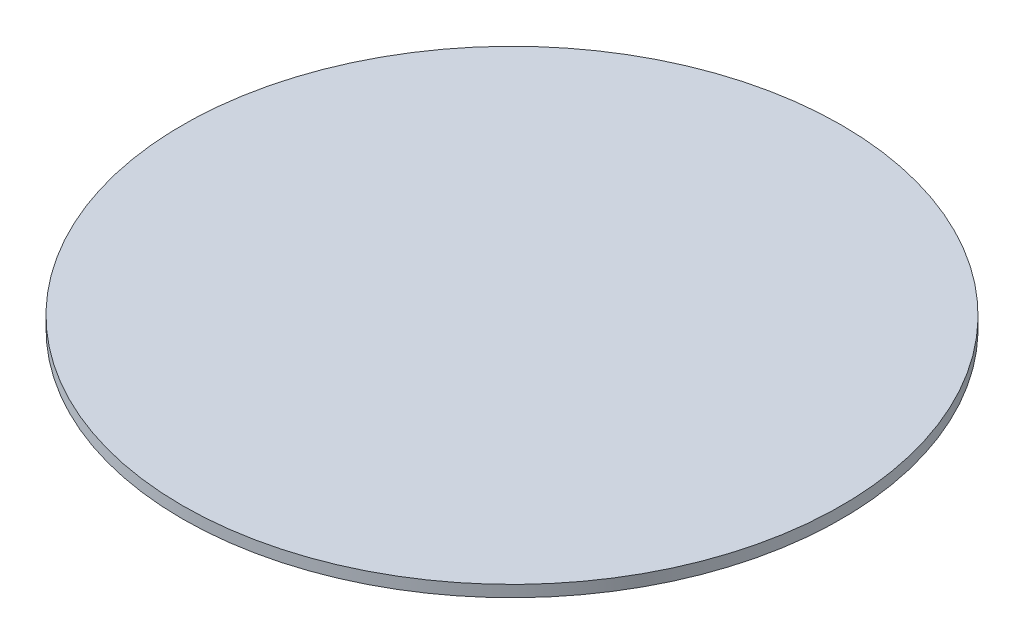
ISO-10303-21;
HEADER;
FILE_DESCRIPTION(('STEP AP214'),'2;1');
FILE_NAME('part.step','',(''),(''),'','','');
FILE_SCHEMA(('AUTOMOTIVE_DESIGN { 1 0 10303 214 1 1 1 1 }'));
ENDSEC;
DATA;
#1=APPLICATION_CONTEXT('core data for automotive mechanical design processes');
#2=APPLICATION_PROTOCOL_DEFINITION('international standard','automotive_design',2000,#1);
#3=PRODUCT_CONTEXT('',#1,'mechanical');
#4=PRODUCT('Part','Part','',(#3));
#5=PRODUCT_RELATED_PRODUCT_CATEGORY('part','',(#4));
#6=PRODUCT_DEFINITION_FORMATION('','',#4);
#7=PRODUCT_DEFINITION_CONTEXT('part definition',#1,'design');
#8=PRODUCT_DEFINITION('design','',#6,#7);
#9=PRODUCT_DEFINITION_SHAPE('','',#8);
#10=(LENGTH_UNIT() NAMED_UNIT(*) SI_UNIT(.MILLI.,.METRE.));
#11=(NAMED_UNIT(*) PLANE_ANGLE_UNIT() SI_UNIT($,.RADIAN.));
#12=(NAMED_UNIT(*) SI_UNIT($,.STERADIAN.) SOLID_ANGLE_UNIT());
#13=UNCERTAINTY_MEASURE_WITH_UNIT(LENGTH_MEASURE(1.E-05),#10,'distance_accuracy_value','');
#14=(GEOMETRIC_REPRESENTATION_CONTEXT(3) GLOBAL_UNCERTAINTY_ASSIGNED_CONTEXT((#13)) GLOBAL_UNIT_ASSIGNED_CONTEXT((#10,
#11,#12)) REPRESENTATION_CONTEXT('',''));
#15=CARTESIAN_POINT('',(0.,0.,0.));
#16=DIRECTION('',(0.,0.,1.));
#17=DIRECTION('',(1.,0.,0.));
#18=AXIS2_PLACEMENT_3D('',#15,#16,#17);
#19=CARTESIAN_POINT('',(0.,7.,0.));
#20=DIRECTION('',(0.,-1.,0.));
#21=DIRECTION('',(0.,0.,-1.));
#22=AXIS2_PLACEMENT_3D('',#19,#20,#21);
#23=CYLINDRICAL_SURFACE('',#22,200.);
#24=CARTESIAN_POINT('',(0.,7.,0.));
#25=DIRECTION('',(0.,1.,0.));
#26=DIRECTION('',(0.,0.,1.));
#27=AXIS2_PLACEMENT_3D('',#24,#25,#26);
#28=CIRCLE('',#27,200.);
#29=CARTESIAN_POINT('',(0.,7.,200.));
#30=VERTEX_POINT('',#29);
#31=EDGE_CURVE('E12',#30,#30,#28,.T.);
#32=ORIENTED_EDGE('',*,*,#31,.F.);
#33=EDGE_LOOP('',(#32));
#34=FACE_BOUND('',#33,.T.);
#35=CARTESIAN_POINT('',(0.,0.,0.));
#36=DIRECTION('',(0.,1.,0.));
#37=DIRECTION('',(0.,0.,1.));
#38=AXIS2_PLACEMENT_3D('',#35,#36,#37);
#39=CIRCLE('',#38,200.);
#40=CARTESIAN_POINT('',(0.,0.,200.));
#41=VERTEX_POINT('',#40);
#42=EDGE_CURVE('E46',#41,#41,#39,.T.);
#43=ORIENTED_EDGE('',*,*,#42,.T.);
#44=EDGE_LOOP('',(#43));
#45=FACE_BOUND('',#44,.T.);
#46=ADVANCED_FACE('F43',(#34,#45),#23,.T.);
#47=CARTESIAN_POINT('',(0.,7.,0.));
#48=DIRECTION('',(0.,1.,0.));
#49=DIRECTION('',(0.,0.,1.));
#50=AXIS2_PLACEMENT_3D('',#47,#48,#49);
#51=PLANE('',#50);
#52=ORIENTED_EDGE('',*,*,#31,.T.);
#53=EDGE_LOOP('',(#52));
#54=FACE_BOUND('',#53,.T.);
#55=ADVANCED_FACE('F58',(#54),#51,.T.);
#56=CARTESIAN_POINT('',(0.,0.,0.));
#57=DIRECTION('',(0.,1.,0.));
#58=DIRECTION('',(0.,0.,1.));
#59=AXIS2_PLACEMENT_3D('',#56,#57,#58);
#60=PLANE('',#59);
#61=ORIENTED_EDGE('',*,*,#42,.F.);
#62=EDGE_LOOP('',(#61));
#63=FACE_BOUND('',#62,.T.);
#64=ADVANCED_FACE('F56',(#63),#60,.F.);
#65=CLOSED_SHELL('',(#46,#55,#64));
#66=MANIFOLD_SOLID_BREP('B2',#65);
#67=ADVANCED_BREP_SHAPE_REPRESENTATION('',(#18,#66),#14);
#68=SHAPE_DEFINITION_REPRESENTATION(#9,#67);
ENDSEC;
END-ISO-10303-21;
